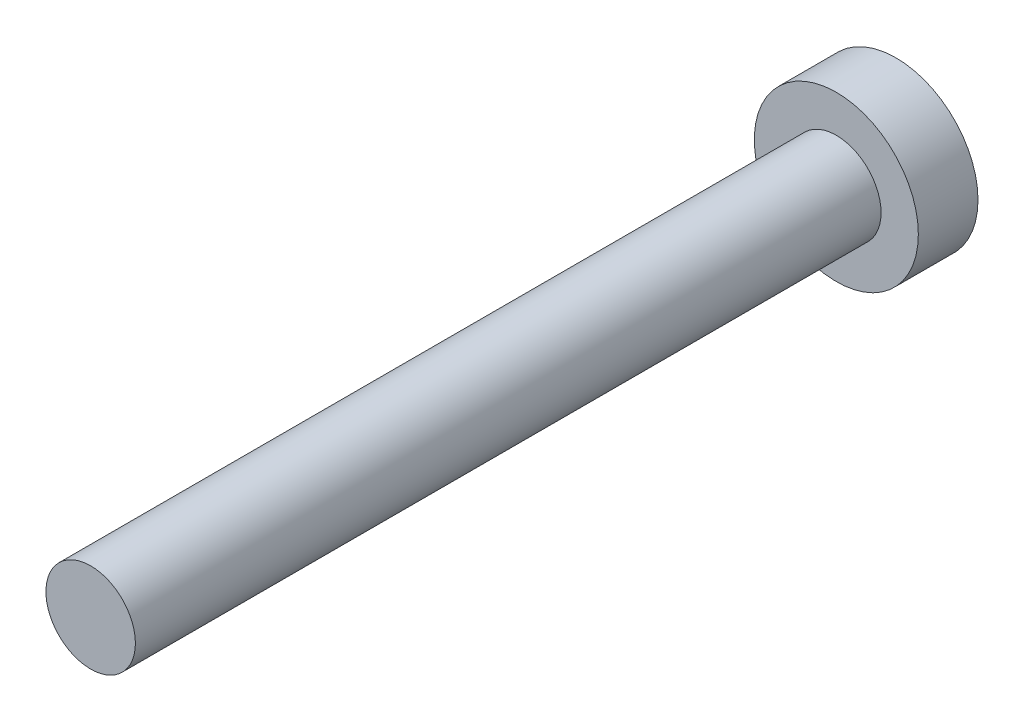
ISO-10303-21;
HEADER;
FILE_DESCRIPTION(('STEP AP214'),'2;1');
FILE_NAME('part.step','',(''),(''),'','','');
FILE_SCHEMA(('AUTOMOTIVE_DESIGN { 1 0 10303 214 1 1 1 1 }'));
ENDSEC;
DATA;
#1=APPLICATION_CONTEXT('core data for automotive mechanical design processes');
#2=APPLICATION_PROTOCOL_DEFINITION('international standard','automotive_design',2000,#1);
#3=PRODUCT_CONTEXT('',#1,'mechanical');
#4=PRODUCT('Part','Part','',(#3));
#5=PRODUCT_RELATED_PRODUCT_CATEGORY('part','',(#4));
#6=PRODUCT_DEFINITION_FORMATION('','',#4);
#7=PRODUCT_DEFINITION_CONTEXT('part definition',#1,'design');
#8=PRODUCT_DEFINITION('design','',#6,#7);
#9=PRODUCT_DEFINITION_SHAPE('','',#8);
#10=(LENGTH_UNIT() NAMED_UNIT(*) SI_UNIT(.MILLI.,.METRE.));
#11=(NAMED_UNIT(*) PLANE_ANGLE_UNIT() SI_UNIT($,.RADIAN.));
#12=(NAMED_UNIT(*) SI_UNIT($,.STERADIAN.) SOLID_ANGLE_UNIT());
#13=UNCERTAINTY_MEASURE_WITH_UNIT(LENGTH_MEASURE(1.E-05),#10,'distance_accuracy_value','');
#14=(GEOMETRIC_REPRESENTATION_CONTEXT(3) GLOBAL_UNCERTAINTY_ASSIGNED_CONTEXT((#13)) GLOBAL_UNIT_ASSIGNED_CONTEXT((#10,
#11,#12)) REPRESENTATION_CONTEXT('',''));
#15=CARTESIAN_POINT('',(0.,0.,0.));
#16=DIRECTION('',(0.,0.,1.));
#17=DIRECTION('',(1.,0.,0.));
#18=AXIS2_PLACEMENT_3D('',#15,#16,#17);
#19=CARTESIAN_POINT('',(0.,0.,2.));
#20=DIRECTION('',(0.,0.,1.));
#21=DIRECTION('',(1.,0.,0.));
#22=AXIS2_PLACEMENT_3D('',#19,#20,#21);
#23=PLANE('',#22);
#24=CARTESIAN_POINT('',(0.,0.,2.));
#25=DIRECTION('',(0.,0.,1.));
#26=DIRECTION('',(1.,0.,0.));
#27=AXIS2_PLACEMENT_3D('',#24,#25,#26);
#28=CIRCLE('',#27,2.75);
#29=CARTESIAN_POINT('',(2.75,0.,2.));
#30=VERTEX_POINT('',#29);
#31=EDGE_CURVE('E10',#30,#30,#28,.T.);
#32=ORIENTED_EDGE('',*,*,#31,.T.);
#33=EDGE_LOOP('',(#32));
#34=FACE_BOUND('',#33,.T.);
#35=CARTESIAN_POINT('',(0.,0.,2.));
#36=DIRECTION('',(0.,0.,1.));
#37=DIRECTION('',(1.,0.,0.));
#38=AXIS2_PLACEMENT_3D('',#35,#36,#37);
#39=CIRCLE('',#38,1.5);
#40=CARTESIAN_POINT('',(1.5,0.,2.));
#41=VERTEX_POINT('',#40);
#42=EDGE_CURVE('E44',#41,#41,#39,.T.);
#43=ORIENTED_EDGE('',*,*,#42,.F.);
#44=EDGE_LOOP('',(#43));
#45=FACE_BOUND('',#44,.T.);
#46=ADVANCED_FACE('F31',(#34,#45),#23,.T.);
#47=CARTESIAN_POINT('',(0.,0.,2.));
#48=DIRECTION('',(0.,0.,-1.));
#49=DIRECTION('',(-1.,0.,0.));
#50=AXIS2_PLACEMENT_3D('',#47,#48,#49);
#51=CYLINDRICAL_SURFACE('',#50,2.75);
#52=ORIENTED_EDGE('',*,*,#31,.F.);
#53=EDGE_LOOP('',(#52));
#54=FACE_BOUND('',#53,.T.);
#55=CARTESIAN_POINT('',(0.,0.,0.));
#56=DIRECTION('',(0.,0.,1.));
#57=DIRECTION('',(1.,0.,0.));
#58=AXIS2_PLACEMENT_3D('',#55,#56,#57);
#59=CIRCLE('',#58,2.75);
#60=CARTESIAN_POINT('',(2.75,0.,0.));
#61=VERTEX_POINT('',#60);
#62=EDGE_CURVE('E35',#61,#61,#59,.T.);
#63=ORIENTED_EDGE('',*,*,#62,.T.);
#64=EDGE_LOOP('',(#63));
#65=FACE_BOUND('',#64,.T.);
#66=ADVANCED_FACE('F33',(#54,#65),#51,.T.);
#67=CARTESIAN_POINT('',(0.,0.,0.));
#68=DIRECTION('',(0.,0.,1.));
#69=DIRECTION('',(1.,0.,0.));
#70=AXIS2_PLACEMENT_3D('',#67,#68,#69);
#71=PLANE('',#70);
#72=ORIENTED_EDGE('',*,*,#62,.F.);
#73=EDGE_LOOP('',(#72));
#74=FACE_BOUND('',#73,.T.);
#75=ADVANCED_FACE('F55',(#74),#71,.F.);
#76=CARTESIAN_POINT('',(0.,0.,27.));
#77=DIRECTION('',(0.,0.,-1.));
#78=DIRECTION('',(-1.,0.,0.));
#79=AXIS2_PLACEMENT_3D('',#76,#77,#78);
#80=CYLINDRICAL_SURFACE('',#79,1.5);
#81=CARTESIAN_POINT('',(0.,0.,27.));
#82=DIRECTION('',(0.,0.,1.));
#83=DIRECTION('',(1.,0.,0.));
#84=AXIS2_PLACEMENT_3D('',#81,#82,#83);
#85=CIRCLE('',#84,1.5);
#86=CARTESIAN_POINT('',(1.5,0.,27.));
#87=VERTEX_POINT('',#86);
#88=EDGE_CURVE('E42',#87,#87,#85,.T.);
#89=ORIENTED_EDGE('',*,*,#88,.F.);
#90=EDGE_LOOP('',(#89));
#91=FACE_BOUND('',#90,.T.);
#92=ORIENTED_EDGE('',*,*,#42,.T.);
#93=EDGE_LOOP('',(#92));
#94=FACE_BOUND('',#93,.T.);
#95=ADVANCED_FACE('F52',(#91,#94),#80,.T.);
#96=CARTESIAN_POINT('',(0.,0.,27.));
#97=DIRECTION('',(0.,0.,1.));
#98=DIRECTION('',(1.,0.,0.));
#99=AXIS2_PLACEMENT_3D('',#96,#97,#98);
#100=PLANE('',#99);
#101=ORIENTED_EDGE('',*,*,#88,.T.);
#102=EDGE_LOOP('',(#101));
#103=FACE_BOUND('',#102,.T.);
#104=ADVANCED_FACE('F50',(#103),#100,.T.);
#105=CLOSED_SHELL('',(#46,#66,#75,#95,#104));
#106=MANIFOLD_SOLID_BREP('B2',#105);
#107=ADVANCED_BREP_SHAPE_REPRESENTATION('',(#18,#106),#14);
#108=SHAPE_DEFINITION_REPRESENTATION(#9,#107);
ENDSEC;
END-ISO-10303-21;
